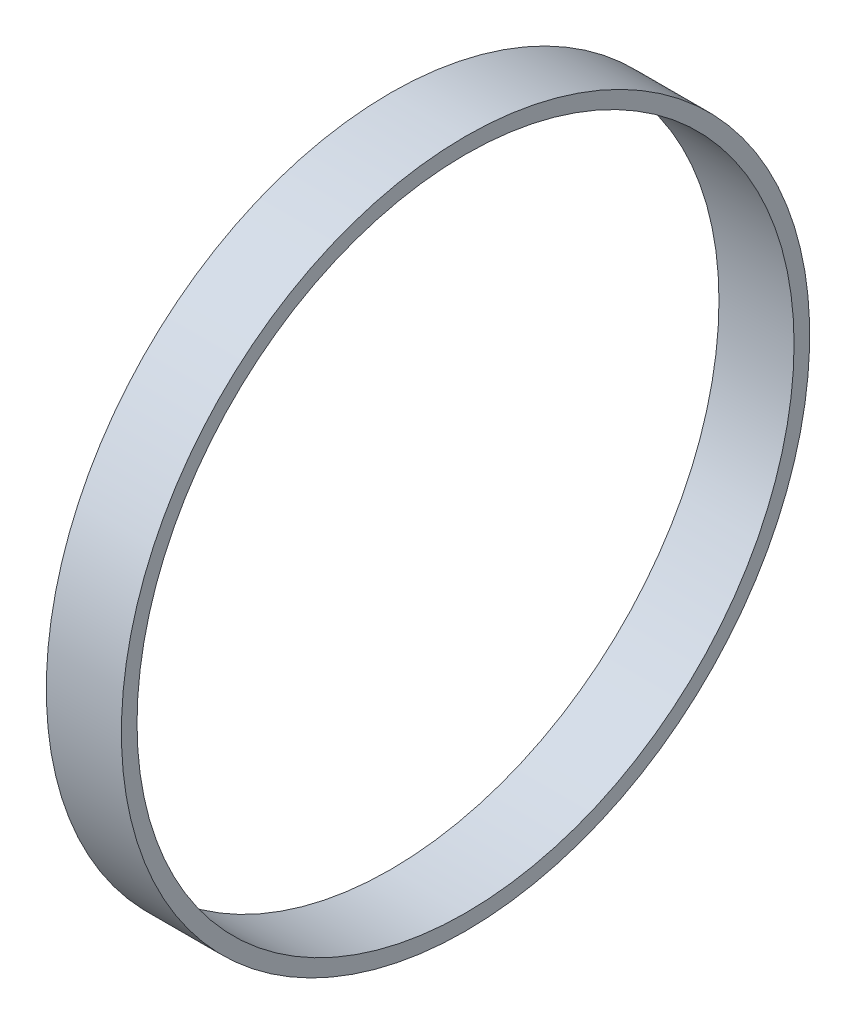
ISO-10303-21;
HEADER;
FILE_DESCRIPTION(('STEP AP214'),'2;1');
FILE_NAME('part.step','',(''),(''),'','','');
FILE_SCHEMA(('AUTOMOTIVE_DESIGN { 1 0 10303 214 1 1 1 1 }'));
ENDSEC;
DATA;
#1=APPLICATION_CONTEXT('core data for automotive mechanical design processes');
#2=APPLICATION_PROTOCOL_DEFINITION('international standard','automotive_design',2000,#1);
#3=PRODUCT_CONTEXT('',#1,'mechanical');
#4=PRODUCT('Part','Part','',(#3));
#5=PRODUCT_RELATED_PRODUCT_CATEGORY('part','',(#4));
#6=PRODUCT_DEFINITION_FORMATION('','',#4);
#7=PRODUCT_DEFINITION_CONTEXT('part definition',#1,'design');
#8=PRODUCT_DEFINITION('design','',#6,#7);
#9=PRODUCT_DEFINITION_SHAPE('','',#8);
#10=(LENGTH_UNIT() NAMED_UNIT(*) SI_UNIT(.MILLI.,.METRE.));
#11=(NAMED_UNIT(*) PLANE_ANGLE_UNIT() SI_UNIT($,.RADIAN.));
#12=(NAMED_UNIT(*) SI_UNIT($,.STERADIAN.) SOLID_ANGLE_UNIT());
#13=UNCERTAINTY_MEASURE_WITH_UNIT(LENGTH_MEASURE(1.E-05),#10,'distance_accuracy_value','');
#14=(GEOMETRIC_REPRESENTATION_CONTEXT(3) GLOBAL_UNCERTAINTY_ASSIGNED_CONTEXT((#13)) GLOBAL_UNIT_ASSIGNED_CONTEXT((#10,
#11,#12)) REPRESENTATION_CONTEXT('',''));
#15=CARTESIAN_POINT('',(0.,0.,0.));
#16=DIRECTION('',(0.,0.,1.));
#17=DIRECTION('',(1.,0.,0.));
#18=AXIS2_PLACEMENT_3D('',#15,#16,#17);
#19=CARTESIAN_POINT('',(44.9,10.75,0.));
#20=DIRECTION('',(-1.,0.,0.));
#21=DIRECTION('',(0.,0.,1.));
#22=AXIS2_PLACEMENT_3D('',#19,#20,#21);
#23=PLANE('',#22);
#24=CARTESIAN_POINT('',(44.9,0.,0.));
#25=DIRECTION('',(1.,0.,0.));
#26=DIRECTION('',(0.,-1.,0.));
#27=AXIS2_PLACEMENT_3D('',#24,#25,#26);
#28=CIRCLE('',#27,10.5);
#29=CARTESIAN_POINT('',(44.9,-10.5,0.));
#30=VERTEX_POINT('',#29);
#31=EDGE_CURVE('E57',#30,#30,#28,.T.);
#32=ORIENTED_EDGE('',*,*,#31,.T.);
#33=EDGE_LOOP('',(#32));
#34=FACE_BOUND('',#33,.T.);
#35=CARTESIAN_POINT('',(44.9,0.,0.));
#36=DIRECTION('',(-1.,0.,0.));
#37=DIRECTION('',(0.,-1.,0.));
#38=AXIS2_PLACEMENT_3D('',#35,#36,#37);
#39=CIRCLE('',#38,11.);
#40=CARTESIAN_POINT('',(44.9,-11.,0.));
#41=VERTEX_POINT('',#40);
#42=EDGE_CURVE('E28',#41,#41,#39,.T.);
#43=ORIENTED_EDGE('',*,*,#42,.T.);
#44=EDGE_LOOP('',(#43));
#45=FACE_BOUND('',#44,.T.);
#46=ADVANCED_FACE('F17',(#34,#45),#23,.T.);
#47=CARTESIAN_POINT('',(46.1,0.,0.));
#48=DIRECTION('',(-1.,0.,0.));
#49=DIRECTION('',(0.,1.,0.));
#50=AXIS2_PLACEMENT_3D('',#47,#48,#49);
#51=CYLINDRICAL_SURFACE('',#50,11.);
#52=ORIENTED_EDGE('',*,*,#42,.F.);
#53=DIRECTION('',(1.,0.,0.));
#54=VECTOR('',#53,1.);
#55=CARTESIAN_POINT('',(46.1,-11.,0.));
#56=LINE('',#55,#54);
#57=CARTESIAN_POINT('',(47.3,-11.,0.));
#58=VERTEX_POINT('',#57);
#59=EDGE_CURVE('E11',#41,#58,#56,.T.);
#60=ORIENTED_EDGE('',*,*,#59,.T.);
#61=CARTESIAN_POINT('',(47.3,0.,0.));
#62=DIRECTION('',(1.,0.,0.));
#63=DIRECTION('',(0.,1.,0.));
#64=AXIS2_PLACEMENT_3D('',#61,#62,#63);
#65=CIRCLE('',#64,11.);
#66=EDGE_CURVE('E60',#58,#58,#65,.T.);
#67=ORIENTED_EDGE('',*,*,#66,.F.);
#68=ORIENTED_EDGE('',*,*,#59,.F.);
#69=EDGE_LOOP('',(#52,#60,#67,#68));
#70=FACE_BOUND('',#69,.T.);
#71=ADVANCED_FACE('F74',(#70),#51,.T.);
#72=CARTESIAN_POINT('',(47.3,10.75,0.));
#73=DIRECTION('',(1.,0.,0.));
#74=DIRECTION('',(0.,1.,0.));
#75=AXIS2_PLACEMENT_3D('',#72,#73,#74);
#76=PLANE('',#75);
#77=CARTESIAN_POINT('',(47.3,0.,0.));
#78=DIRECTION('',(-1.,0.,0.));
#79=DIRECTION('',(0.,-1.,0.));
#80=AXIS2_PLACEMENT_3D('',#77,#78,#79);
#81=CIRCLE('',#80,10.5);
#82=CARTESIAN_POINT('',(47.3,-10.5,0.));
#83=VERTEX_POINT('',#82);
#84=EDGE_CURVE('E21',#83,#83,#81,.T.);
#85=ORIENTED_EDGE('',*,*,#84,.T.);
#86=EDGE_LOOP('',(#85));
#87=FACE_BOUND('',#86,.T.);
#88=ORIENTED_EDGE('',*,*,#66,.T.);
#89=EDGE_LOOP('',(#88));
#90=FACE_BOUND('',#89,.T.);
#91=ADVANCED_FACE('F19',(#87,#90),#76,.T.);
#92=CARTESIAN_POINT('',(46.1,0.,0.));
#93=DIRECTION('',(-1.,0.,0.));
#94=DIRECTION('',(0.,1.,0.));
#95=AXIS2_PLACEMENT_3D('',#92,#93,#94);
#96=CYLINDRICAL_SURFACE('',#95,10.5);
#97=ORIENTED_EDGE('',*,*,#84,.F.);
#98=DIRECTION('',(-1.,0.,0.));
#99=VECTOR('',#98,1.);
#100=CARTESIAN_POINT('',(46.1,-10.5,0.));
#101=LINE('',#100,#99);
#102=EDGE_CURVE('E51',#83,#30,#101,.T.);
#103=ORIENTED_EDGE('',*,*,#102,.T.);
#104=ORIENTED_EDGE('',*,*,#31,.F.);
#105=ORIENTED_EDGE('',*,*,#102,.F.);
#106=EDGE_LOOP('',(#97,#103,#104,#105));
#107=FACE_BOUND('',#106,.T.);
#108=ADVANCED_FACE('F77',(#107),#96,.F.);
#109=CLOSED_SHELL('',(#46,#71,#91,#108));
#110=MANIFOLD_SOLID_BREP('B1',#109);
#111=ADVANCED_BREP_SHAPE_REPRESENTATION('',(#18,#110),#14);
#112=SHAPE_DEFINITION_REPRESENTATION(#9,#111);
ENDSEC;
END-ISO-10303-21;
